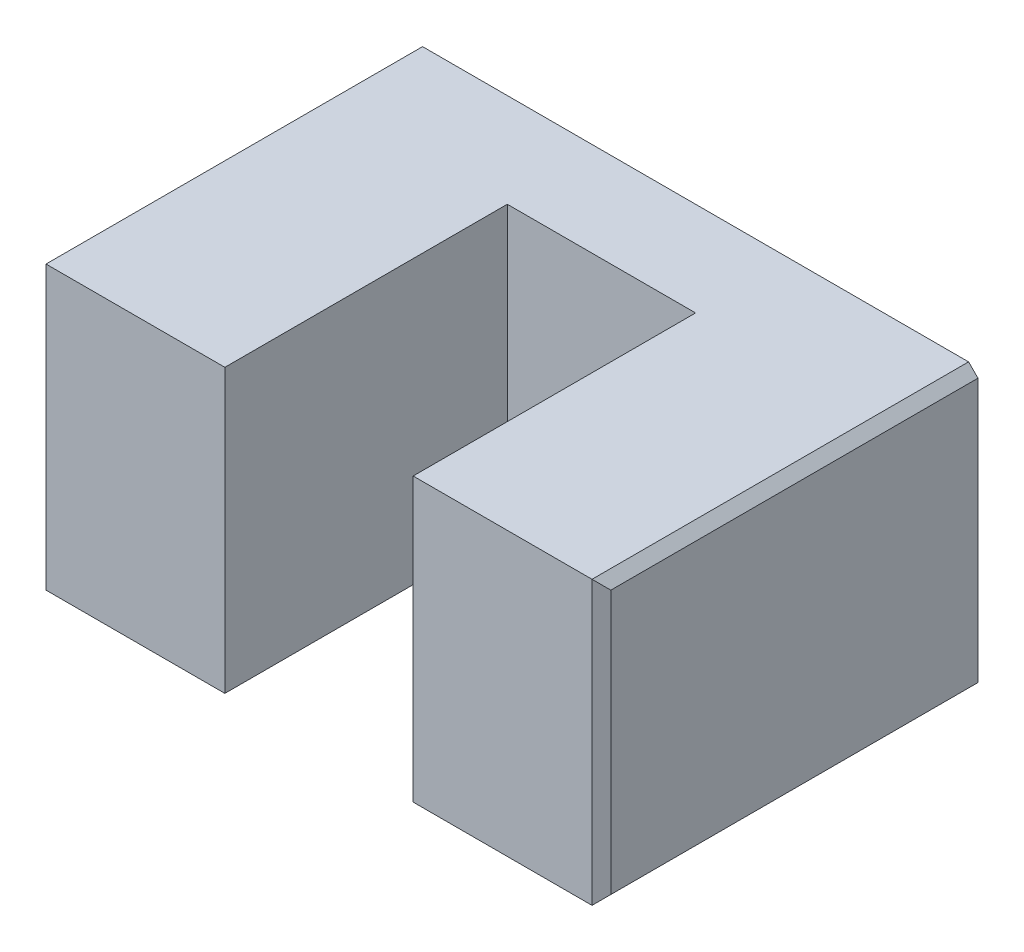
ISO-10303-21;
HEADER;
FILE_DESCRIPTION(('STEP AP214'),'2;1');
FILE_NAME('part.step','',(''),(''),'','','');
FILE_SCHEMA(('AUTOMOTIVE_DESIGN { 1 0 10303 214 1 1 1 1 }'));
ENDSEC;
DATA;
#1=APPLICATION_CONTEXT('core data for automotive mechanical design processes');
#2=APPLICATION_PROTOCOL_DEFINITION('international standard','automotive_design',2000,#1);
#3=PRODUCT_CONTEXT('',#1,'mechanical');
#4=PRODUCT('Part','Part','',(#3));
#5=PRODUCT_RELATED_PRODUCT_CATEGORY('part','',(#4));
#6=PRODUCT_DEFINITION_FORMATION('','',#4);
#7=PRODUCT_DEFINITION_CONTEXT('part definition',#1,'design');
#8=PRODUCT_DEFINITION('design','',#6,#7);
#9=PRODUCT_DEFINITION_SHAPE('','',#8);
#10=(LENGTH_UNIT() NAMED_UNIT(*) SI_UNIT(.MILLI.,.METRE.));
#11=(NAMED_UNIT(*) PLANE_ANGLE_UNIT() SI_UNIT($,.RADIAN.));
#12=(NAMED_UNIT(*) SI_UNIT($,.STERADIAN.) SOLID_ANGLE_UNIT());
#13=UNCERTAINTY_MEASURE_WITH_UNIT(LENGTH_MEASURE(1.E-05),#10,'distance_accuracy_value','');
#14=(GEOMETRIC_REPRESENTATION_CONTEXT(3) GLOBAL_UNCERTAINTY_ASSIGNED_CONTEXT((#13)) GLOBAL_UNIT_ASSIGNED_CONTEXT((#10,
#11,#12)) REPRESENTATION_CONTEXT('',''));
#15=CARTESIAN_POINT('',(0.,0.,0.));
#16=DIRECTION('',(0.,0.,1.));
#17=DIRECTION('',(1.,0.,0.));
#18=AXIS2_PLACEMENT_3D('',#15,#16,#17);
#19=CARTESIAN_POINT('',(0.,0.,0.));
#20=DIRECTION('',(0.,1.,0.));
#21=DIRECTION('',(0.,0.,1.));
#22=AXIS2_PLACEMENT_3D('',#19,#20,#21);
#23=PLANE('',#22);
#24=DIRECTION('',(-1.,0.,0.));
#25=VECTOR('',#24,1.);
#26=CARTESIAN_POINT('',(30.,0.,0.));
#27=LINE('',#26,#25);
#28=CARTESIAN_POINT('',(29.,0.,0.));
#29=VERTEX_POINT('',#28);
#30=CARTESIAN_POINT('',(20.,0.,0.));
#31=VERTEX_POINT('',#30);
#32=EDGE_CURVE('E252',#29,#31,#27,.T.);
#33=ORIENTED_EDGE('',*,*,#32,.F.);
#34=DIRECTION('',(0.,0.,1.));
#35=VECTOR('',#34,1.);
#36=CARTESIAN_POINT('',(29.,0.,0.));
#37=LINE('',#36,#35);
#38=CARTESIAN_POINT('',(29.,0.,40.));
#39=VERTEX_POINT('',#38);
#40=EDGE_CURVE('E207',#29,#39,#37,.T.);
#41=ORIENTED_EDGE('',*,*,#40,.T.);
#42=DIRECTION('',(1.,0.,0.));
#43=VECTOR('',#42,1.);
#44=CARTESIAN_POINT('',(10.,0.,40.));
#45=LINE('',#44,#43);
#46=CARTESIAN_POINT('',(10.,0.,40.));
#47=VERTEX_POINT('',#46);
#48=EDGE_CURVE('E263',#47,#39,#45,.T.);
#49=ORIENTED_EDGE('',*,*,#48,.F.);
#50=DIRECTION('',(0.,0.,1.));
#51=VECTOR('',#50,1.);
#52=CARTESIAN_POINT('',(10.,0.,10.));
#53=LINE('',#52,#51);
#54=CARTESIAN_POINT('',(10.,0.,10.));
#55=VERTEX_POINT('',#54);
#56=EDGE_CURVE('E174',#55,#47,#53,.T.);
#57=ORIENTED_EDGE('',*,*,#56,.F.);
#58=DIRECTION('',(0.,0.,-1.));
#59=VECTOR('',#58,1.);
#60=CARTESIAN_POINT('',(10.,0.,20.));
#61=LINE('',#60,#59);
#62=CARTESIAN_POINT('',(10.,0.,5.));
#63=VERTEX_POINT('',#62);
#64=EDGE_CURVE('E154',#63,#55,#61,.F.);
#65=ORIENTED_EDGE('',*,*,#64,.F.);
#66=DIRECTION('',(1.,0.,0.));
#67=VECTOR('',#66,1.);
#68=CARTESIAN_POINT('',(0.,0.,5.));
#69=LINE('',#68,#67);
#70=CARTESIAN_POINT('',(20.,0.,5.));
#71=VERTEX_POINT('',#70);
#72=EDGE_CURVE('E166',#63,#71,#69,.T.);
#73=ORIENTED_EDGE('',*,*,#72,.T.);
#74=DIRECTION('',(0.,0.,-1.));
#75=VECTOR('',#74,1.);
#76=CARTESIAN_POINT('',(20.,0.,5.));
#77=LINE('',#76,#75);
#78=EDGE_CURVE('E162',#31,#71,#77,.F.);
#79=ORIENTED_EDGE('',*,*,#78,.F.);
#80=EDGE_LOOP('',(#33,#41,#49,#57,#65,#73,#79));
#81=FACE_BOUND('',#80,.T.);
#82=ADVANCED_FACE('F43',(#81),#23,.F.);
#83=DIRECTION('',(1.,0.,0.));
#84=VECTOR('',#83,1.);
#85=CARTESIAN_POINT('',(-30.,0.,40.));
#86=LINE('',#85,#84);
#87=CARTESIAN_POINT('',(-29.,0.,40.));
#88=VERTEX_POINT('',#87);
#89=CARTESIAN_POINT('',(-10.,0.,40.));
#90=VERTEX_POINT('',#89);
#91=EDGE_CURVE('E245',#88,#90,#86,.T.);
#92=ORIENTED_EDGE('',*,*,#91,.F.);
#93=DIRECTION('',(0.,0.,-1.));
#94=VECTOR('',#93,1.);
#95=CARTESIAN_POINT('',(-29.,0.,0.));
#96=LINE('',#95,#94);
#97=CARTESIAN_POINT('',(-29.,0.,0.));
#98=VERTEX_POINT('',#97);
#99=EDGE_CURVE('E52',#88,#98,#96,.T.);
#100=ORIENTED_EDGE('',*,*,#99,.T.);
#101=CARTESIAN_POINT('',(-20.,0.,0.));
#102=VERTEX_POINT('',#101);
#103=EDGE_CURVE('E244',#102,#98,#27,.T.);
#104=ORIENTED_EDGE('',*,*,#103,.F.);
#105=DIRECTION('',(0.,0.,-1.));
#106=VECTOR('',#105,1.);
#107=CARTESIAN_POINT('',(-20.,0.,5.));
#108=LINE('',#107,#106);
#109=CARTESIAN_POINT('',(-20.,0.,5.));
#110=VERTEX_POINT('',#109);
#111=EDGE_CURVE('E185',#110,#102,#108,.T.);
#112=ORIENTED_EDGE('',*,*,#111,.F.);
#113=CARTESIAN_POINT('',(-10.,0.,5.));
#114=VERTEX_POINT('',#113);
#115=EDGE_CURVE('E178',#110,#114,#69,.T.);
#116=ORIENTED_EDGE('',*,*,#115,.T.);
#117=DIRECTION('',(0.,0.,-1.));
#118=VECTOR('',#117,1.);
#119=CARTESIAN_POINT('',(-10.,0.,20.));
#120=LINE('',#119,#118);
#121=CARTESIAN_POINT('',(-10.,0.,10.));
#122=VERTEX_POINT('',#121);
#123=EDGE_CURVE('E158',#122,#114,#120,.T.);
#124=ORIENTED_EDGE('',*,*,#123,.F.);
#125=DIRECTION('',(0.,0.,-1.));
#126=VECTOR('',#125,1.);
#127=CARTESIAN_POINT('',(-10.,0.,40.));
#128=LINE('',#127,#126);
#129=EDGE_CURVE('E257',#90,#122,#128,.T.);
#130=ORIENTED_EDGE('',*,*,#129,.F.);
#131=EDGE_LOOP('',(#92,#100,#104,#112,#116,#124,#130));
#132=FACE_BOUND('',#131,.T.);
#133=ADVANCED_FACE('F238',(#132),#23,.F.);
#134=CARTESIAN_POINT('',(30.,30.,0.));
#135=DIRECTION('',(0.,0.,1.));
#136=DIRECTION('',(1.,0.,0.));
#137=AXIS2_PLACEMENT_3D('',#134,#135,#136);
#138=PLANE('',#137);
#139=CARTESIAN_POINT('',(0.,0.,0.));
#140=DIRECTION('',(0.,0.,1.));
#141=DIRECTION('',(1.,0.,0.));
#142=AXIS2_PLACEMENT_3D('',#139,#140,#141);
#143=CIRCLE('',#142,10.);
#144=CARTESIAN_POINT('',(10.,0.,0.));
#145=VERTEX_POINT('',#144);
#146=EDGE_CURVE('E221',#145,#145,#143,.T.);
#147=ORIENTED_EDGE('',*,*,#146,.T.);
#148=EDGE_LOOP('',(#147));
#149=FACE_BOUND('',#148,.T.);
#150=DIRECTION('',(-1.,0.,0.));
#151=VECTOR('',#150,1.);
#152=CARTESIAN_POINT('',(30.,30.,0.));
#153=LINE('',#152,#151);
#154=CARTESIAN_POINT('',(29.,30.,0.));
#155=VERTEX_POINT('',#154);
#156=CARTESIAN_POINT('',(-29.,30.,0.));
#157=VERTEX_POINT('',#156);
#158=EDGE_CURVE('E266',#155,#157,#153,.T.);
#159=ORIENTED_EDGE('',*,*,#158,.F.);
#160=DIRECTION('',(0.707106781186555,-0.70710678118654,0.));
#161=VECTOR('',#160,1.);
#162=CARTESIAN_POINT('',(29.,30.,0.));
#163=LINE('',#162,#161);
#164=CARTESIAN_POINT('',(30.,29.,0.));
#165=VERTEX_POINT('',#164);
#166=EDGE_CURVE('E203',#155,#165,#163,.T.);
#167=ORIENTED_EDGE('',*,*,#166,.T.);
#168=DIRECTION('',(0.,-1.,0.));
#169=VECTOR('',#168,1.);
#170=CARTESIAN_POINT('',(30.,30.,0.));
#171=LINE('',#170,#169);
#172=CARTESIAN_POINT('',(30.,0.999999999999994,0.));
#173=VERTEX_POINT('',#172);
#174=EDGE_CURVE('E270',#165,#173,#171,.T.);
#175=ORIENTED_EDGE('',*,*,#174,.T.);
#176=DIRECTION('',(0.707106781186555,0.70710678118654,0.));
#177=VECTOR('',#176,1.);
#178=CARTESIAN_POINT('',(30.,0.999999999999994,0.));
#179=LINE('',#178,#177);
#180=EDGE_CURVE('E200',#173,#29,#179,.F.);
#181=ORIENTED_EDGE('',*,*,#180,.T.);
#182=ORIENTED_EDGE('',*,*,#32,.T.);
#183=CARTESIAN_POINT('',(0.,0.,0.));
#184=DIRECTION('',(0.,0.,1.));
#185=DIRECTION('',(1.,0.,0.));
#186=AXIS2_PLACEMENT_3D('',#183,#184,#185);
#187=CIRCLE('',#186,20.);
#188=EDGE_CURVE('E253',#102,#31,#187,.T.);
#189=ORIENTED_EDGE('',*,*,#188,.F.);
#190=ORIENTED_EDGE('',*,*,#103,.T.);
#191=DIRECTION('',(0.707106781186545,-0.70710678118655,0.));
#192=VECTOR('',#191,1.);
#193=CARTESIAN_POINT('',(-30.,1.00000000000001,0.));
#194=LINE('',#193,#192);
#195=CARTESIAN_POINT('',(-30.,1.00000000000001,0.));
#196=VERTEX_POINT('',#195);
#197=EDGE_CURVE('E195',#98,#196,#194,.F.);
#198=ORIENTED_EDGE('',*,*,#197,.T.);
#199=DIRECTION('',(0.,-1.,0.));
#200=VECTOR('',#199,1.);
#201=CARTESIAN_POINT('',(-30.,30.,0.));
#202=LINE('',#201,#200);
#203=CARTESIAN_POINT('',(-30.,29.,0.));
#204=VERTEX_POINT('',#203);
#205=EDGE_CURVE('E180',#204,#196,#202,.T.);
#206=ORIENTED_EDGE('',*,*,#205,.F.);
#207=DIRECTION('',(0.707106781186545,0.70710678118655,0.));
#208=VECTOR('',#207,1.);
#209=CARTESIAN_POINT('',(-29.,30.,0.));
#210=LINE('',#209,#208);
#211=EDGE_CURVE('E197',#204,#157,#210,.T.);
#212=ORIENTED_EDGE('',*,*,#211,.T.);
#213=EDGE_LOOP('',(#159,#167,#175,#181,#182,#189,#190,#198,#206,#212));
#214=FACE_BOUND('',#213,.T.);
#215=ADVANCED_FACE('F249',(#149,#214),#138,.F.);
#216=CARTESIAN_POINT('',(-30.,30.,0.));
#217=DIRECTION('',(1.,0.,0.));
#218=DIRECTION('',(0.,0.,-1.));
#219=AXIS2_PLACEMENT_3D('',#216,#217,#218);
#220=PLANE('',#219);
#221=DIRECTION('',(0.,1.,0.));
#222=VECTOR('',#221,1.);
#223=CARTESIAN_POINT('',(-30.,30.,39.));
#224=LINE('',#223,#222);
#225=CARTESIAN_POINT('',(-30.,1.00000000000001,39.));
#226=VERTEX_POINT('',#225);
#227=CARTESIAN_POINT('',(-30.,29.,39.));
#228=VERTEX_POINT('',#227);
#229=EDGE_CURVE('E67',#226,#228,#224,.T.);
#230=ORIENTED_EDGE('',*,*,#229,.T.);
#231=DIRECTION('',(0.,0.,-1.));
#232=VECTOR('',#231,1.);
#233=CARTESIAN_POINT('',(-30.,29.,0.));
#234=LINE('',#233,#232);
#235=EDGE_CURVE('E216',#228,#204,#234,.T.);
#236=ORIENTED_EDGE('',*,*,#235,.T.);
#237=ORIENTED_EDGE('',*,*,#205,.T.);
#238=DIRECTION('',(0.,0.,1.));
#239=VECTOR('',#238,1.);
#240=CARTESIAN_POINT('',(-30.,1.00000000000001,0.));
#241=LINE('',#240,#239);
#242=EDGE_CURVE('E212',#196,#226,#241,.T.);
#243=ORIENTED_EDGE('',*,*,#242,.T.);
#244=EDGE_LOOP('',(#230,#236,#237,#243));
#245=FACE_BOUND('',#244,.T.);
#246=ADVANCED_FACE('F350',(#245),#220,.F.);
#247=CARTESIAN_POINT('',(-30.,30.,40.));
#248=DIRECTION('',(0.,0.,-1.));
#249=DIRECTION('',(-1.,0.,0.));
#250=AXIS2_PLACEMENT_3D('',#247,#248,#249);
#251=PLANE('',#250);
#252=DIRECTION('',(1.,0.,0.));
#253=VECTOR('',#252,1.);
#254=CARTESIAN_POINT('',(-30.,30.,40.));
#255=LINE('',#254,#253);
#256=CARTESIAN_POINT('',(-29.,30.,40.));
#257=VERTEX_POINT('',#256);
#258=CARTESIAN_POINT('',(-10.,30.,40.));
#259=VERTEX_POINT('',#258);
#260=EDGE_CURVE('E293',#257,#259,#255,.T.);
#261=ORIENTED_EDGE('',*,*,#260,.F.);
#262=DIRECTION('',(0.,-1.,0.));
#263=VECTOR('',#262,1.);
#264=CARTESIAN_POINT('',(-29.,30.,40.));
#265=LINE('',#264,#263);
#266=EDGE_CURVE('E11',#257,#88,#265,.T.);
#267=ORIENTED_EDGE('',*,*,#266,.T.);
#268=ORIENTED_EDGE('',*,*,#91,.T.);
#269=DIRECTION('',(0.,-1.,0.));
#270=VECTOR('',#269,1.);
#271=CARTESIAN_POINT('',(-10.,30.,40.));
#272=LINE('',#271,#270);
#273=EDGE_CURVE('E184',#259,#90,#272,.T.);
#274=ORIENTED_EDGE('',*,*,#273,.F.);
#275=EDGE_LOOP('',(#261,#267,#268,#274));
#276=FACE_BOUND('',#275,.T.);
#277=ADVANCED_FACE('F343',(#276),#251,.F.);
#278=CARTESIAN_POINT('',(-10.,30.,40.));
#279=DIRECTION('',(-1.,0.,0.));
#280=DIRECTION('',(0.,0.,1.));
#281=AXIS2_PLACEMENT_3D('',#278,#279,#280);
#282=PLANE('',#281);
#283=ORIENTED_EDGE('',*,*,#129,.T.);
#284=DIRECTION('',(0.,-1.,0.));
#285=VECTOR('',#284,1.);
#286=CARTESIAN_POINT('',(-10.,30.,10.));
#287=LINE('',#286,#285);
#288=CARTESIAN_POINT('',(-10.,30.,10.));
#289=VERTEX_POINT('',#288);
#290=EDGE_CURVE('E277',#289,#122,#287,.T.);
#291=ORIENTED_EDGE('',*,*,#290,.F.);
#292=DIRECTION('',(0.,0.,-1.));
#293=VECTOR('',#292,1.);
#294=CARTESIAN_POINT('',(-10.,30.,40.));
#295=LINE('',#294,#293);
#296=EDGE_CURVE('E285',#259,#289,#295,.T.);
#297=ORIENTED_EDGE('',*,*,#296,.F.);
#298=ORIENTED_EDGE('',*,*,#273,.T.);
#299=EDGE_LOOP('',(#283,#291,#297,#298));
#300=FACE_BOUND('',#299,.T.);
#301=ADVANCED_FACE('F284',(#300),#282,.F.);
#302=CARTESIAN_POINT('',(-10.,30.,10.));
#303=DIRECTION('',(0.,0.,-1.));
#304=DIRECTION('',(-1.,0.,0.));
#305=AXIS2_PLACEMENT_3D('',#302,#303,#304);
#306=PLANE('',#305);
#307=CARTESIAN_POINT('',(0.,0.,10.));
#308=DIRECTION('',(0.,0.,-1.));
#309=DIRECTION('',(-1.,0.,0.));
#310=AXIS2_PLACEMENT_3D('',#307,#308,#309);
#311=CIRCLE('',#310,10.);
#312=EDGE_CURVE('E172',#55,#122,#311,.F.);
#313=ORIENTED_EDGE('',*,*,#312,.F.);
#314=DIRECTION('',(0.,-1.,0.));
#315=VECTOR('',#314,1.);
#316=CARTESIAN_POINT('',(10.,30.,10.));
#317=LINE('',#316,#315);
#318=CARTESIAN_POINT('',(10.,30.,10.));
#319=VERTEX_POINT('',#318);
#320=EDGE_CURVE('E272',#319,#55,#317,.T.);
#321=ORIENTED_EDGE('',*,*,#320,.F.);
#322=DIRECTION('',(1.,0.,0.));
#323=VECTOR('',#322,1.);
#324=CARTESIAN_POINT('',(-10.,30.,10.));
#325=LINE('',#324,#323);
#326=EDGE_CURVE('E290',#289,#319,#325,.T.);
#327=ORIENTED_EDGE('',*,*,#326,.F.);
#328=ORIENTED_EDGE('',*,*,#290,.T.);
#329=EDGE_LOOP('',(#313,#321,#327,#328));
#330=FACE_BOUND('',#329,.T.);
#331=ADVANCED_FACE('F289',(#330),#306,.F.);
#332=CARTESIAN_POINT('',(10.,30.,10.));
#333=DIRECTION('',(1.,0.,0.));
#334=DIRECTION('',(0.,0.,-1.));
#335=AXIS2_PLACEMENT_3D('',#332,#333,#334);
#336=PLANE('',#335);
#337=ORIENTED_EDGE('',*,*,#56,.T.);
#338=DIRECTION('',(0.,-1.,0.));
#339=VECTOR('',#338,1.);
#340=CARTESIAN_POINT('',(10.,30.,40.));
#341=LINE('',#340,#339);
#342=CARTESIAN_POINT('',(10.,30.,40.));
#343=VERTEX_POINT('',#342);
#344=EDGE_CURVE('E269',#343,#47,#341,.T.);
#345=ORIENTED_EDGE('',*,*,#344,.F.);
#346=DIRECTION('',(0.,0.,1.));
#347=VECTOR('',#346,1.);
#348=CARTESIAN_POINT('',(10.,30.,10.));
#349=LINE('',#348,#347);
#350=EDGE_CURVE('E291',#319,#343,#349,.T.);
#351=ORIENTED_EDGE('',*,*,#350,.F.);
#352=ORIENTED_EDGE('',*,*,#320,.T.);
#353=EDGE_LOOP('',(#337,#345,#351,#352));
#354=FACE_BOUND('',#353,.T.);
#355=ADVANCED_FACE('F333',(#354),#336,.F.);
#356=CARTESIAN_POINT('',(10.,30.,40.));
#357=DIRECTION('',(0.,0.,-1.));
#358=DIRECTION('',(-1.,0.,0.));
#359=AXIS2_PLACEMENT_3D('',#356,#357,#358);
#360=PLANE('',#359);
#361=ORIENTED_EDGE('',*,*,#48,.T.);
#362=DIRECTION('',(0.,1.,0.));
#363=VECTOR('',#362,1.);
#364=CARTESIAN_POINT('',(29.,30.,40.));
#365=LINE('',#364,#363);
#366=CARTESIAN_POINT('',(29.,30.,40.));
#367=VERTEX_POINT('',#366);
#368=EDGE_CURVE('E211',#39,#367,#365,.T.);
#369=ORIENTED_EDGE('',*,*,#368,.T.);
#370=DIRECTION('',(1.,0.,0.));
#371=VECTOR('',#370,1.);
#372=CARTESIAN_POINT('',(10.,30.,40.));
#373=LINE('',#372,#371);
#374=EDGE_CURVE('E260',#343,#367,#373,.T.);
#375=ORIENTED_EDGE('',*,*,#374,.F.);
#376=ORIENTED_EDGE('',*,*,#344,.T.);
#377=EDGE_LOOP('',(#361,#369,#375,#376));
#378=FACE_BOUND('',#377,.T.);
#379=ADVANCED_FACE('F332',(#378),#360,.F.);
#380=CARTESIAN_POINT('',(30.,30.,40.));
#381=DIRECTION('',(-1.,0.,0.));
#382=DIRECTION('',(0.,0.,1.));
#383=AXIS2_PLACEMENT_3D('',#380,#381,#382);
#384=PLANE('',#383);
#385=ORIENTED_EDGE('',*,*,#174,.F.);
#386=DIRECTION('',(0.,0.,1.));
#387=VECTOR('',#386,1.);
#388=CARTESIAN_POINT('',(30.,29.,40.));
#389=LINE('',#388,#387);
#390=CARTESIAN_POINT('',(30.,29.,39.));
#391=VERTEX_POINT('',#390);
#392=EDGE_CURVE('E210',#165,#391,#389,.T.);
#393=ORIENTED_EDGE('',*,*,#392,.T.);
#394=DIRECTION('',(0.,-1.,0.));
#395=VECTOR('',#394,1.);
#396=CARTESIAN_POINT('',(30.,30.,39.));
#397=LINE('',#396,#395);
#398=CARTESIAN_POINT('',(30.,0.999999999999994,39.));
#399=VERTEX_POINT('',#398);
#400=EDGE_CURVE('E201',#391,#399,#397,.T.);
#401=ORIENTED_EDGE('',*,*,#400,.T.);
#402=DIRECTION('',(0.,0.,-1.));
#403=VECTOR('',#402,1.);
#404=CARTESIAN_POINT('',(30.,0.999999999999994,40.));
#405=LINE('',#404,#403);
#406=EDGE_CURVE('E202',#399,#173,#405,.T.);
#407=ORIENTED_EDGE('',*,*,#406,.T.);
#408=EDGE_LOOP('',(#385,#393,#401,#407));
#409=FACE_BOUND('',#408,.T.);
#410=ADVANCED_FACE('F327',(#409),#384,.F.);
#411=CARTESIAN_POINT('',(0.,30.,0.));
#412=DIRECTION('',(0.,1.,0.));
#413=DIRECTION('',(0.,0.,1.));
#414=AXIS2_PLACEMENT_3D('',#411,#412,#413);
#415=PLANE('',#414);
#416=ORIENTED_EDGE('',*,*,#374,.T.);
#417=DIRECTION('',(0.,0.,-1.));
#418=VECTOR('',#417,1.);
#419=CARTESIAN_POINT('',(29.,30.,0.));
#420=LINE('',#419,#418);
#421=EDGE_CURVE('E192',#367,#155,#420,.T.);
#422=ORIENTED_EDGE('',*,*,#421,.T.);
#423=ORIENTED_EDGE('',*,*,#158,.T.);
#424=DIRECTION('',(0.,0.,1.));
#425=VECTOR('',#424,1.);
#426=CARTESIAN_POINT('',(-29.,30.,40.));
#427=LINE('',#426,#425);
#428=EDGE_CURVE('E165',#157,#257,#427,.T.);
#429=ORIENTED_EDGE('',*,*,#428,.T.);
#430=ORIENTED_EDGE('',*,*,#260,.T.);
#431=ORIENTED_EDGE('',*,*,#296,.T.);
#432=ORIENTED_EDGE('',*,*,#326,.T.);
#433=ORIENTED_EDGE('',*,*,#350,.T.);
#434=EDGE_LOOP('',(#416,#422,#423,#429,#430,#431,#432,#433));
#435=FACE_BOUND('',#434,.T.);
#436=ADVANCED_FACE('F326',(#435),#415,.T.);
#437=CARTESIAN_POINT('',(0.,0.,5.));
#438=DIRECTION('',(0.,0.,-1.));
#439=DIRECTION('',(-1.,0.,0.));
#440=AXIS2_PLACEMENT_3D('',#437,#438,#439);
#441=CYLINDRICAL_SURFACE('',#440,20.);
#442=ORIENTED_EDGE('',*,*,#188,.T.);
#443=ORIENTED_EDGE('',*,*,#78,.T.);
#444=CARTESIAN_POINT('',(0.,0.,5.));
#445=DIRECTION('',(0.,0.,1.));
#446=DIRECTION('',(1.,0.,0.));
#447=AXIS2_PLACEMENT_3D('',#444,#445,#446);
#448=CIRCLE('',#447,20.);
#449=EDGE_CURVE('E177',#110,#71,#448,.T.);
#450=ORIENTED_EDGE('',*,*,#449,.F.);
#451=ORIENTED_EDGE('',*,*,#111,.T.);
#452=EDGE_LOOP('',(#442,#443,#450,#451));
#453=FACE_BOUND('',#452,.T.);
#454=ADVANCED_FACE('F318',(#453),#441,.T.);
#455=CARTESIAN_POINT('',(0.,0.,5.));
#456=DIRECTION('',(0.,0.,1.));
#457=DIRECTION('',(1.,0.,0.));
#458=AXIS2_PLACEMENT_3D('',#455,#456,#457);
#459=PLANE('',#458);
#460=ORIENTED_EDGE('',*,*,#72,.F.);
#461=CARTESIAN_POINT('',(0.,0.,5.));
#462=DIRECTION('',(0.,0.,1.));
#463=DIRECTION('',(1.,0.,0.));
#464=AXIS2_PLACEMENT_3D('',#461,#462,#463);
#465=CIRCLE('',#464,10.);
#466=EDGE_CURVE('E151',#63,#114,#465,.F.);
#467=ORIENTED_EDGE('',*,*,#466,.T.);
#468=ORIENTED_EDGE('',*,*,#115,.F.);
#469=ORIENTED_EDGE('',*,*,#449,.T.);
#470=EDGE_LOOP('',(#460,#467,#468,#469));
#471=FACE_BOUND('',#470,.T.);
#472=ADVANCED_FACE('F171',(#471),#459,.T.);
#473=CARTESIAN_POINT('',(0.,0.,20.));
#474=DIRECTION('',(0.,0.,-1.));
#475=DIRECTION('',(-1.,0.,0.));
#476=AXIS2_PLACEMENT_3D('',#473,#474,#475);
#477=CYLINDRICAL_SURFACE('',#476,10.);
#478=ORIENTED_EDGE('',*,*,#146,.F.);
#479=EDGE_LOOP('',(#478));
#480=FACE_BOUND('',#479,.T.);
#481=ORIENTED_EDGE('',*,*,#312,.T.);
#482=ORIENTED_EDGE('',*,*,#123,.T.);
#483=ORIENTED_EDGE('',*,*,#466,.F.);
#484=ORIENTED_EDGE('',*,*,#64,.T.);
#485=EDGE_LOOP('',(#481,#482,#483,#484));
#486=FACE_BOUND('',#485,.T.);
#487=ADVANCED_FACE('F152',(#480,#486),#477,.F.);
#488=CARTESIAN_POINT('',(30.,0.999999999999994,40.));
#489=DIRECTION('',(-0.70710678118654,0.707106781186555,0.));
#490=DIRECTION('',(0.,0.,-1.));
#491=AXIS2_PLACEMENT_3D('',#488,#489,#490);
#492=PLANE('',#491);
#493=ORIENTED_EDGE('',*,*,#180,.F.);
#494=ORIENTED_EDGE('',*,*,#406,.F.);
#495=DIRECTION('',(0.577350269189634,0.577350269189622,-0.577350269189622));
#496=VECTOR('',#495,1.);
#497=CARTESIAN_POINT('',(39.6666666666667,10.6666666666665,29.3333333333335));
#498=LINE('',#497,#496);
#499=EDGE_CURVE('E225',#39,#399,#498,.T.);
#500=ORIENTED_EDGE('',*,*,#499,.F.);
#501=ORIENTED_EDGE('',*,*,#40,.F.);
#502=EDGE_LOOP('',(#493,#494,#500,#501));
#503=FACE_BOUND('',#502,.T.);
#504=ADVANCED_FACE('F306',(#503),#492,.F.);
#505=CARTESIAN_POINT('',(30.,30.,39.));
#506=DIRECTION('',(-0.70710678118654,0.,-0.707106781186555));
#507=DIRECTION('',(0.,-1.,0.));
#508=AXIS2_PLACEMENT_3D('',#505,#506,#507);
#509=PLANE('',#508);
#510=ORIENTED_EDGE('',*,*,#499,.T.);
#511=ORIENTED_EDGE('',*,*,#400,.F.);
#512=DIRECTION('',(0.577350269189634,-0.577350269189622,-0.577350269189622));
#513=VECTOR('',#512,1.);
#514=CARTESIAN_POINT('',(29.6666666666667,29.3333333333333,39.3333333333333));
#515=LINE('',#514,#513);
#516=EDGE_CURVE('E218',#367,#391,#515,.T.);
#517=ORIENTED_EDGE('',*,*,#516,.F.);
#518=ORIENTED_EDGE('',*,*,#368,.F.);
#519=EDGE_LOOP('',(#510,#511,#517,#518));
#520=FACE_BOUND('',#519,.T.);
#521=ADVANCED_FACE('F312',(#520),#509,.F.);
#522=CARTESIAN_POINT('',(29.,30.,0.));
#523=DIRECTION('',(0.70710678118654,0.707106781186555,0.));
#524=DIRECTION('',(0.,0.,1.));
#525=AXIS2_PLACEMENT_3D('',#522,#523,#524);
#526=PLANE('',#525);
#527=ORIENTED_EDGE('',*,*,#516,.T.);
#528=ORIENTED_EDGE('',*,*,#392,.F.);
#529=ORIENTED_EDGE('',*,*,#166,.F.);
#530=ORIENTED_EDGE('',*,*,#421,.F.);
#531=EDGE_LOOP('',(#527,#528,#529,#530));
#532=FACE_BOUND('',#531,.T.);
#533=ADVANCED_FACE('F352',(#532),#526,.T.);
#534=CARTESIAN_POINT('',(-30.,1.00000000000001,0.));
#535=DIRECTION('',(0.70710678118655,0.707106781186545,0.));
#536=DIRECTION('',(0.,0.,1.));
#537=AXIS2_PLACEMENT_3D('',#534,#535,#536);
#538=PLANE('',#537);
#539=ORIENTED_EDGE('',*,*,#197,.F.);
#540=ORIENTED_EDGE('',*,*,#99,.F.);
#541=DIRECTION('',(0.577350269189623,-0.577350269189627,0.577350269189627));
#542=VECTOR('',#541,1.);
#543=CARTESIAN_POINT('',(-39.,10.,30.));
#544=LINE('',#543,#542);
#545=EDGE_CURVE('E48',#226,#88,#544,.T.);
#546=ORIENTED_EDGE('',*,*,#545,.F.);
#547=ORIENTED_EDGE('',*,*,#242,.F.);
#548=EDGE_LOOP('',(#539,#540,#546,#547));
#549=FACE_BOUND('',#548,.T.);
#550=ADVANCED_FACE('F46',(#549),#538,.F.);
#551=CARTESIAN_POINT('',(-29.,30.,40.));
#552=DIRECTION('',(0.70710678118655,0.,-0.707106781186545));
#553=DIRECTION('',(0.,-1.,0.));
#554=AXIS2_PLACEMENT_3D('',#551,#552,#553);
#555=PLANE('',#554);
#556=ORIENTED_EDGE('',*,*,#545,.T.);
#557=ORIENTED_EDGE('',*,*,#266,.F.);
#558=DIRECTION('',(0.577350269189623,0.577350269189627,0.577350269189627));
#559=VECTOR('',#558,1.);
#560=CARTESIAN_POINT('',(-29.,30.,40.));
#561=LINE('',#560,#559);
#562=EDGE_CURVE('E223',#228,#257,#561,.T.);
#563=ORIENTED_EDGE('',*,*,#562,.F.);
#564=ORIENTED_EDGE('',*,*,#229,.F.);
#565=EDGE_LOOP('',(#556,#557,#563,#564));
#566=FACE_BOUND('',#565,.T.);
#567=ADVANCED_FACE('F232',(#566),#555,.F.);
#568=CARTESIAN_POINT('',(-29.,30.,0.));
#569=DIRECTION('',(-0.70710678118655,0.707106781186545,0.));
#570=DIRECTION('',(0.,0.,-1.));
#571=AXIS2_PLACEMENT_3D('',#568,#569,#570);
#572=PLANE('',#571);
#573=ORIENTED_EDGE('',*,*,#211,.F.);
#574=ORIENTED_EDGE('',*,*,#235,.F.);
#575=ORIENTED_EDGE('',*,*,#562,.T.);
#576=ORIENTED_EDGE('',*,*,#428,.F.);
#577=EDGE_LOOP('',(#573,#574,#575,#576));
#578=FACE_BOUND('',#577,.T.);
#579=ADVANCED_FACE('F369',(#578),#572,.T.);
#580=CLOSED_SHELL('',(#82,#133,#215,#246,#277,#301,#331,#355,#379,#410,#436,#454,#472,#487,#504,
#521,#533,#550,#567,#579));
#581=MANIFOLD_SOLID_BREP('B2',#580);
#582=ADVANCED_BREP_SHAPE_REPRESENTATION('',(#18,#581),#14);
#583=SHAPE_DEFINITION_REPRESENTATION(#9,#582);
ENDSEC;
END-ISO-10303-21;
